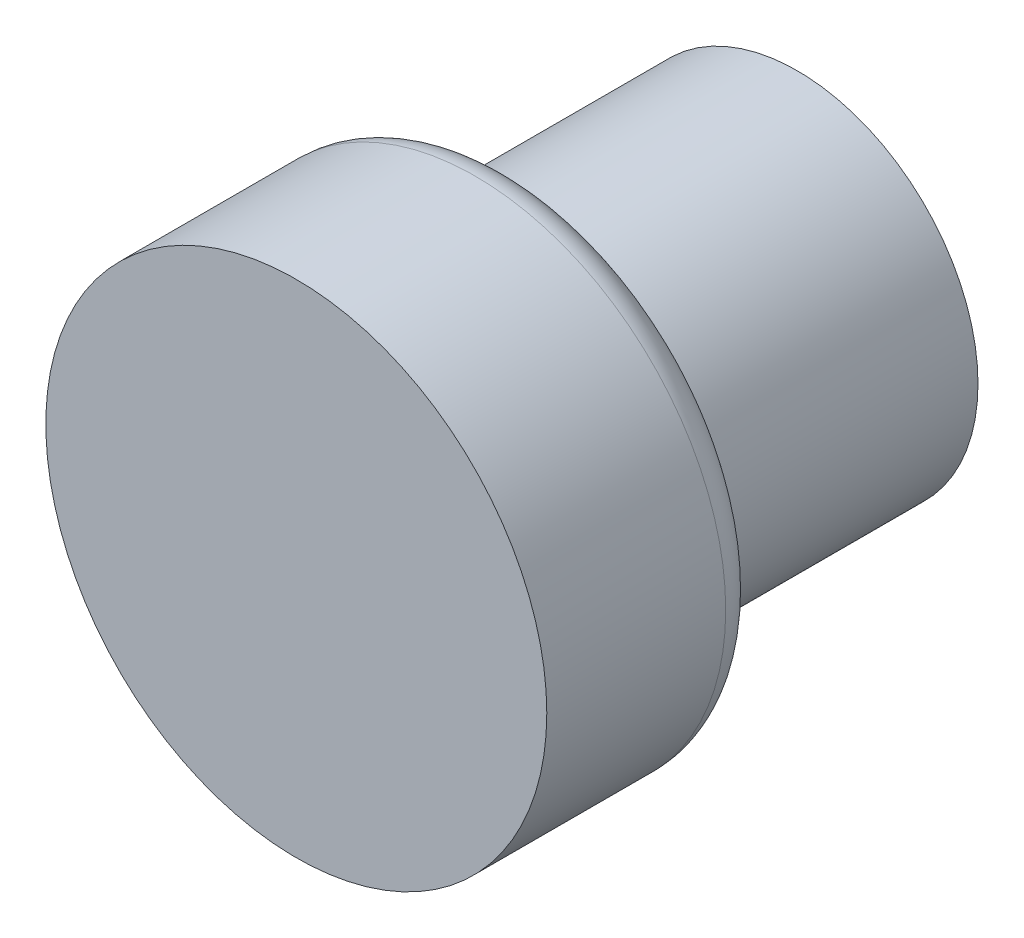
ISO-10303-21;
HEADER;
FILE_DESCRIPTION(('STEP AP214'),'2;1');
FILE_NAME('part.step','',(''),(''),'','','');
FILE_SCHEMA(('AUTOMOTIVE_DESIGN { 1 0 10303 214 1 1 1 1 }'));
ENDSEC;
DATA;
#1=APPLICATION_CONTEXT('core data for automotive mechanical design processes');
#2=APPLICATION_PROTOCOL_DEFINITION('international standard','automotive_design',2000,#1);
#3=PRODUCT_CONTEXT('',#1,'mechanical');
#4=PRODUCT('Part','Part','',(#3));
#5=PRODUCT_RELATED_PRODUCT_CATEGORY('part','',(#4));
#6=PRODUCT_DEFINITION_FORMATION('','',#4);
#7=PRODUCT_DEFINITION_CONTEXT('part definition',#1,'design');
#8=PRODUCT_DEFINITION('design','',#6,#7);
#9=PRODUCT_DEFINITION_SHAPE('','',#8);
#10=(LENGTH_UNIT() NAMED_UNIT(*) SI_UNIT(.MILLI.,.METRE.));
#11=(NAMED_UNIT(*) PLANE_ANGLE_UNIT() SI_UNIT($,.RADIAN.));
#12=(NAMED_UNIT(*) SI_UNIT($,.STERADIAN.) SOLID_ANGLE_UNIT());
#13=UNCERTAINTY_MEASURE_WITH_UNIT(LENGTH_MEASURE(1.E-05),#10,'distance_accuracy_value','');
#14=(GEOMETRIC_REPRESENTATION_CONTEXT(3) GLOBAL_UNCERTAINTY_ASSIGNED_CONTEXT((#13)) GLOBAL_UNIT_ASSIGNED_CONTEXT((#10,
#11,#12)) REPRESENTATION_CONTEXT('',''));
#15=CARTESIAN_POINT('',(0.,0.,0.));
#16=DIRECTION('',(0.,0.,1.));
#17=DIRECTION('',(1.,0.,0.));
#18=AXIS2_PLACEMENT_3D('',#15,#16,#17);
#19=CARTESIAN_POINT('',(0.,0.,4.));
#20=DIRECTION('',(0.,0.,-1.));
#21=DIRECTION('',(-1.,0.,0.));
#22=AXIS2_PLACEMENT_3D('',#19,#20,#21);
#23=CYLINDRICAL_SURFACE('',#22,2.525);
#24=CARTESIAN_POINT('',(0.,0.,4.));
#25=DIRECTION('',(0.,0.,1.));
#26=DIRECTION('',(1.,0.,0.));
#27=AXIS2_PLACEMENT_3D('',#24,#25,#26);
#28=CIRCLE('',#27,2.525);
#29=CARTESIAN_POINT('',(2.525,0.,4.));
#30=VERTEX_POINT('',#29);
#31=EDGE_CURVE('E50',#30,#30,#28,.T.);
#32=ORIENTED_EDGE('',*,*,#31,.F.);
#33=EDGE_LOOP('',(#32));
#34=FACE_BOUND('',#33,.T.);
#35=CARTESIAN_POINT('',(0.,0.,0.));
#36=DIRECTION('',(0.,0.,1.));
#37=DIRECTION('',(1.,0.,0.));
#38=AXIS2_PLACEMENT_3D('',#35,#36,#37);
#39=CIRCLE('',#38,2.525);
#40=CARTESIAN_POINT('',(2.525,0.,0.));
#41=VERTEX_POINT('',#40);
#42=EDGE_CURVE('E55',#41,#41,#39,.T.);
#43=ORIENTED_EDGE('',*,*,#42,.T.);
#44=EDGE_LOOP('',(#43));
#45=FACE_BOUND('',#44,.T.);
#46=ADVANCED_FACE('F37',(#34,#45),#23,.T.);
#47=CARTESIAN_POINT('',(0.,0.,0.));
#48=DIRECTION('',(0.,0.,1.));
#49=DIRECTION('',(1.,0.,0.));
#50=AXIS2_PLACEMENT_3D('',#47,#48,#49);
#51=PLANE('',#50);
#52=ORIENTED_EDGE('',*,*,#42,.F.);
#53=EDGE_LOOP('',(#52));
#54=FACE_BOUND('',#53,.T.);
#55=ADVANCED_FACE('F70',(#54),#51,.F.);
#56=CARTESIAN_POINT('',(0.,0.,7.));
#57=DIRECTION('',(0.,0.,-1.));
#58=DIRECTION('',(-1.,0.,0.));
#59=AXIS2_PLACEMENT_3D('',#56,#57,#58);
#60=CYLINDRICAL_SURFACE('',#59,3.5);
#61=CARTESIAN_POINT('',(0.,0.,4.5));
#62=DIRECTION('',(0.,0.,1.));
#63=DIRECTION('',(1.,0.,0.));
#64=AXIS2_PLACEMENT_3D('',#61,#62,#63);
#65=CIRCLE('',#64,3.5);
#66=CARTESIAN_POINT('',(3.5,0.,4.5));
#67=VERTEX_POINT('',#66);
#68=EDGE_CURVE('E45',#67,#67,#65,.T.);
#69=ORIENTED_EDGE('',*,*,#68,.T.);
#70=EDGE_LOOP('',(#69));
#71=FACE_BOUND('',#70,.T.);
#72=CARTESIAN_POINT('',(0.,0.,7.));
#73=DIRECTION('',(0.,0.,1.));
#74=DIRECTION('',(1.,0.,0.));
#75=AXIS2_PLACEMENT_3D('',#72,#73,#74);
#76=CIRCLE('',#75,3.5);
#77=CARTESIAN_POINT('',(3.5,0.,7.));
#78=VERTEX_POINT('',#77);
#79=EDGE_CURVE('E60',#78,#78,#76,.T.);
#80=ORIENTED_EDGE('',*,*,#79,.F.);
#81=EDGE_LOOP('',(#80));
#82=FACE_BOUND('',#81,.T.);
#83=ADVANCED_FACE('F68',(#71,#82),#60,.T.);
#84=CARTESIAN_POINT('',(0.,0.,7.));
#85=DIRECTION('',(0.,0.,1.));
#86=DIRECTION('',(1.,0.,0.));
#87=AXIS2_PLACEMENT_3D('',#84,#85,#86);
#88=PLANE('',#87);
#89=ORIENTED_EDGE('',*,*,#79,.T.);
#90=EDGE_LOOP('',(#89));
#91=FACE_BOUND('',#90,.T.);
#92=ADVANCED_FACE('F66',(#91),#88,.T.);
#93=CARTESIAN_POINT('',(0.,0.,4.));
#94=DIRECTION('',(0.,0.,1.));
#95=DIRECTION('',(1.,0.,0.));
#96=AXIS2_PLACEMENT_3D('',#93,#94,#95);
#97=PLANE('',#96);
#98=CARTESIAN_POINT('',(0.,0.,4.));
#99=DIRECTION('',(0.,0.,1.));
#100=DIRECTION('',(1.,0.,0.));
#101=AXIS2_PLACEMENT_3D('',#98,#99,#100);
#102=CIRCLE('',#101,3.);
#103=CARTESIAN_POINT('',(3.,0.,4.));
#104=VERTEX_POINT('',#103);
#105=EDGE_CURVE('E10',#104,#104,#102,.F.);
#106=ORIENTED_EDGE('',*,*,#105,.T.);
#107=EDGE_LOOP('',(#106));
#108=FACE_BOUND('',#107,.T.);
#109=ORIENTED_EDGE('',*,*,#31,.T.);
#110=EDGE_LOOP('',(#109));
#111=FACE_BOUND('',#110,.T.);
#112=ADVANCED_FACE('F76',(#108,#111),#97,.F.);
#113=CARTESIAN_POINT('',(0.,0.,4.5));
#114=DIRECTION('',(0.,0.,1.));
#115=DIRECTION('',(1.,0.,0.));
#116=AXIS2_PLACEMENT_3D('',#113,#114,#115);
#117=TOROIDAL_SURFACE('',#116,3.,0.5);
#118=ORIENTED_EDGE('',*,*,#105,.F.);
#119=EDGE_LOOP('',(#118));
#120=FACE_BOUND('',#119,.T.);
#121=ORIENTED_EDGE('',*,*,#68,.F.);
#122=EDGE_LOOP('',(#121));
#123=FACE_BOUND('',#122,.T.);
#124=ADVANCED_FACE('F39',(#120,#123),#117,.T.);
#125=CLOSED_SHELL('',(#46,#55,#83,#92,#112,#124));
#126=MANIFOLD_SOLID_BREP('B2',#125);
#127=ADVANCED_BREP_SHAPE_REPRESENTATION('',(#18,#126),#14);
#128=SHAPE_DEFINITION_REPRESENTATION(#9,#127);
ENDSEC;
END-ISO-10303-21;
